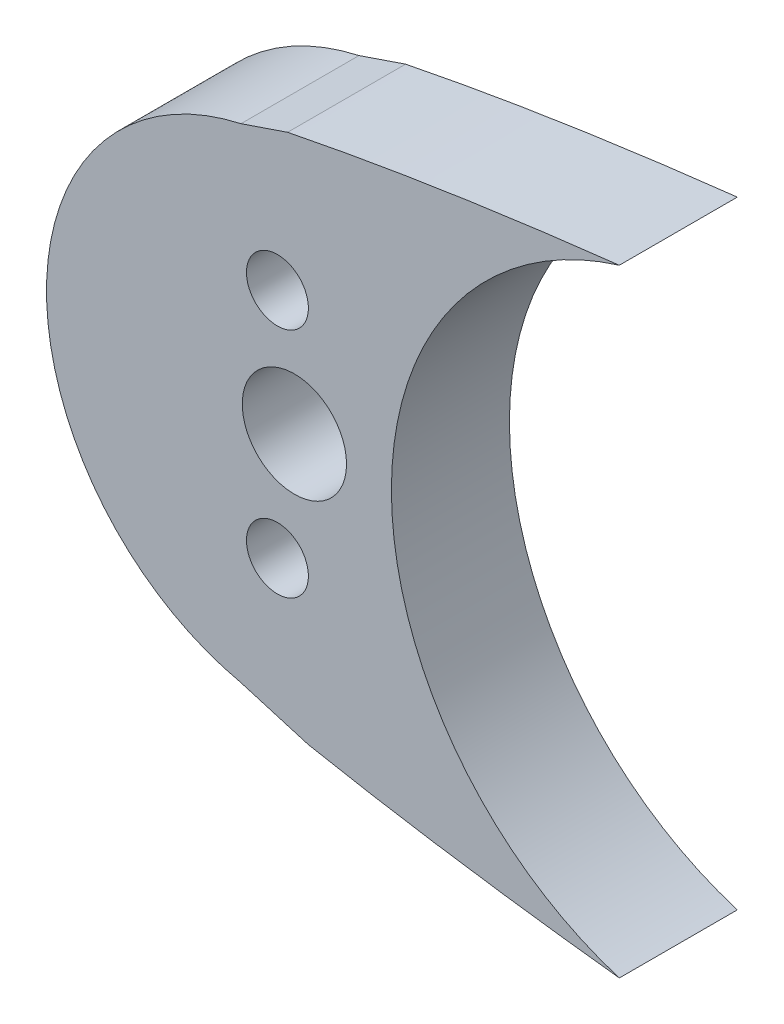
ISO-10303-21;
HEADER;
FILE_DESCRIPTION(('STEP AP214'),'2;1');
FILE_NAME('part.step','',(''),(''),'','','');
FILE_SCHEMA(('AUTOMOTIVE_DESIGN { 1 0 10303 214 1 1 1 1 }'));
ENDSEC;
DATA;
#1=APPLICATION_CONTEXT('core data for automotive mechanical design processes');
#2=APPLICATION_PROTOCOL_DEFINITION('international standard','automotive_design',2000,#1);
#3=PRODUCT_CONTEXT('',#1,'mechanical');
#4=PRODUCT('Part','Part','',(#3));
#5=PRODUCT_RELATED_PRODUCT_CATEGORY('part','',(#4));
#6=PRODUCT_DEFINITION_FORMATION('','',#4);
#7=PRODUCT_DEFINITION_CONTEXT('part definition',#1,'design');
#8=PRODUCT_DEFINITION('design','',#6,#7);
#9=PRODUCT_DEFINITION_SHAPE('','',#8);
#10=(LENGTH_UNIT() NAMED_UNIT(*) SI_UNIT(.MILLI.,.METRE.));
#11=(NAMED_UNIT(*) PLANE_ANGLE_UNIT() SI_UNIT($,.RADIAN.));
#12=(NAMED_UNIT(*) SI_UNIT($,.STERADIAN.) SOLID_ANGLE_UNIT());
#13=UNCERTAINTY_MEASURE_WITH_UNIT(LENGTH_MEASURE(1.E-05),#10,'distance_accuracy_value','');
#14=(GEOMETRIC_REPRESENTATION_CONTEXT(3) GLOBAL_UNCERTAINTY_ASSIGNED_CONTEXT((#13)) GLOBAL_UNIT_ASSIGNED_CONTEXT((#10,
#11,#12)) REPRESENTATION_CONTEXT('',''));
#15=CARTESIAN_POINT('',(0.,0.,0.));
#16=DIRECTION('',(0.,0.,1.));
#17=DIRECTION('',(1.,0.,0.));
#18=AXIS2_PLACEMENT_3D('',#15,#16,#17);
#19=CARTESIAN_POINT('',(300.,0.378,10.25));
#20=CARTESIAN_POINT('',(299.845901447221,0.39961034336831,10.25));
#21=CARTESIAN_POINT('',(299.230346714046,0.48593399083917,10.25));
#22=CARTESIAN_POINT('',(297.848901683276,0.678531057447331,10.25));
#23=CARTESIAN_POINT('',(295.556029122455,0.996787499241564,10.25));
#24=CARTESIAN_POINT('',(292.365739581197,1.43343203295321,10.25));
#25=CARTESIAN_POINT('',(288.297856433401,1.98344889126347,10.25));
#26=CARTESIAN_POINT('',(283.377248038078,2.63572648359042,10.25));
#27=CARTESIAN_POINT('',(277.63430498472,3.38149178862329,10.25));
#28=CARTESIAN_POINT('',(271.104515413466,4.20901604095742,10.25));
#29=CARTESIAN_POINT('',(263.828064626846,5.10718872872647,10.25));
#30=CARTESIAN_POINT('',(255.849823781818,6.06276893212352,10.25));
#31=CARTESIAN_POINT('',(247.21903434379,7.06424307195608,10.25));
#32=CARTESIAN_POINT('',(237.988783489903,8.09787318806774,10.25));
#33=CARTESIAN_POINT('',(228.216029511608,9.15107036010328,10.25));
#34=CARTESIAN_POINT('',(217.961088379031,10.2107446574668,10.25));
#35=CARTESIAN_POINT('',(207.287161839572,11.2632209265187,10.25));
#36=CARTESIAN_POINT('',(196.260086850424,12.2937248064858,10.25));
#37=CARTESIAN_POINT('',(184.947773044503,13.2887281219597,10.25));
#38=CARTESIAN_POINT('',(173.420088229148,14.2315961384787,10.25));
#39=CARTESIAN_POINT('',(161.747864995533,15.1069553720124,10.25));
#40=CARTESIAN_POINT('',(150.00317252135,15.8985540753976,10.25));
#41=CARTESIAN_POINT('',(138.258374542497,16.5898406039741,10.25));
#42=CARTESIAN_POINT('',(126.585774705795,17.1633504747405,10.25));
#43=CARTESIAN_POINT('',(115.057462615139,17.6037905135667,10.25));
#44=CARTESIAN_POINT('',(103.744181572864,17.8967919128621,10.25));
#45=CARTESIAN_POINT('',(92.7158453472272,18.0280433746414,10.25));
#46=CARTESIAN_POINT('',(82.0402185013839,17.9871287273908,10.25));
#47=CARTESIAN_POINT('',(71.7831190583338,17.7661449762132,10.25));
#48=CARTESIAN_POINT('',(62.0076841473254,17.3594904245971,10.25));
#49=CARTESIAN_POINT('',(52.7740834437817,16.7661013276277,10.25));
#50=CARTESIAN_POINT('',(44.1390669938569,15.987763153894,10.25));
#51=CARTESIAN_POINT('',(36.1554749512941,15.0305547578774,10.25));
#52=CARTESIAN_POINT('',(28.8719698679608,13.9026205663682,10.25));
#53=CARTESIAN_POINT('',(22.3326880228315,12.6157408879695,10.25));
#54=CARTESIAN_POINT('',(16.5759570466198,11.1844668147641,10.25));
#55=CARTESIAN_POINT('',(11.6344891822112,9.62275505380201,10.25));
#56=CARTESIAN_POINT('',(7.53339032845527,7.94515078115887,10.25));
#57=CARTESIAN_POINT('',(4.28573900369485,6.16300377839948,10.25));
#58=CARTESIAN_POINT('',(1.8965325692393,4.27279663699588,10.25));
#59=CARTESIAN_POINT('',(0.366265286449645,2.2288009510305,10.25));
#60=CARTESIAN_POINT('',(-0.170692645797294,0.,10.25));
#61=CARTESIAN_POINT('',(0.366265286449666,-2.22880095103055,10.25));
#62=CARTESIAN_POINT('',(1.89653256923925,-4.27279663699582,10.25));
#63=CARTESIAN_POINT('',(4.28573900369493,-6.16300377839955,10.25));
#64=CARTESIAN_POINT('',(7.53339032845521,-7.94515078115883,10.25));
#65=CARTESIAN_POINT('',(11.6344891822112,-9.62275505380201,10.25));
#66=CARTESIAN_POINT('',(16.5759570466199,-11.1844668147641,10.25));
#67=CARTESIAN_POINT('',(22.3326880228314,-12.6157408879695,10.25));
#68=CARTESIAN_POINT('',(28.8719698679608,-13.9026205663682,10.25));
#69=CARTESIAN_POINT('',(36.155474951294,-15.0305547578773,10.25));
#70=CARTESIAN_POINT('',(44.1390669938569,-15.987763153894,10.25));
#71=CARTESIAN_POINT('',(52.7740834437817,-16.7661013276277,10.25));
#72=CARTESIAN_POINT('',(62.0076841473254,-17.3594904245971,10.25));
#73=CARTESIAN_POINT('',(71.7831190583338,-17.7661449762132,10.25));
#74=CARTESIAN_POINT('',(82.0402185013839,-17.9871287273908,10.25));
#75=CARTESIAN_POINT('',(92.7158453472273,-18.0280433746414,10.25));
#76=CARTESIAN_POINT('',(103.744181572864,-17.8967919128621,10.25));
#77=CARTESIAN_POINT('',(115.057462615139,-17.6037905135667,10.25));
#78=CARTESIAN_POINT('',(126.585774705795,-17.1633504747405,10.25));
#79=CARTESIAN_POINT('',(138.258374542497,-16.5898406039741,10.25));
#80=CARTESIAN_POINT('',(150.00317252135,-15.8985540753976,10.25));
#81=CARTESIAN_POINT('',(161.747864995533,-15.1069553720124,10.25));
#82=CARTESIAN_POINT('',(173.420088229148,-14.2315961384787,10.25));
#83=CARTESIAN_POINT('',(184.947773044503,-13.2887281219597,10.25));
#84=CARTESIAN_POINT('',(196.260086850424,-12.2937248064858,10.25));
#85=CARTESIAN_POINT('',(207.287161839572,-11.2632209265187,10.25));
#86=CARTESIAN_POINT('',(217.961088379031,-10.2107446574668,10.25));
#87=CARTESIAN_POINT('',(228.216029511608,-9.15107036010328,10.25));
#88=CARTESIAN_POINT('',(237.988783489903,-8.09787318806774,10.25));
#89=CARTESIAN_POINT('',(247.21903434379,-7.06424307195608,10.25));
#90=CARTESIAN_POINT('',(255.849823781818,-6.0627689321235,10.25));
#91=CARTESIAN_POINT('',(263.828064626846,-5.10718872872648,10.25));
#92=CARTESIAN_POINT('',(271.104515413466,-4.20901604095741,10.25));
#93=CARTESIAN_POINT('',(277.63430498472,-3.38149178862329,10.25));
#94=CARTESIAN_POINT('',(283.377248038078,-2.63572648359043,10.25));
#95=CARTESIAN_POINT('',(288.297856433401,-1.98344889126346,10.25));
#96=CARTESIAN_POINT('',(292.365739581198,-1.43343203295321,10.25));
#97=CARTESIAN_POINT('',(295.556029122455,-0.996787499241567,10.25));
#98=CARTESIAN_POINT('',(297.848901683276,-0.678531057447318,10.25));
#99=CARTESIAN_POINT('',(299.230346714046,-0.48593399083919,10.25));
#100=CARTESIAN_POINT('',(299.845901447221,-0.399610343368311,10.25));
#101=CARTESIAN_POINT('',(300.,-0.378,10.25));
#102=B_SPLINE_CURVE_WITH_KNOTS('',3,(#19,#20,#21,#22,#23,#24,#25,#26,#27,#28,#29,#30,#31,#32,
#33,#34,#35,#36,#37,#38,#39,#40,#41,#42,#43,#44,#45,#46,#47,#48,#49,#50,#51,#52,#53,#54,#55,#56,
#57,#58,#59,#60,#61,#62,#63,#64,#65,#66,#67,#68,#69,#70,#71,#72,#73,#74,#75,#76,#77,#78,#79,#80,
#81,#82,#83,#84,#85,#86,#87,#88,#89,#90,#91,#92,#93,#94,#95,#96,#97,#98,#99,#100,#101),
.UNSPECIFIED.,.F.,.F.,(4,1,1,1,1,1,1,1,1,1,1,1,1,1,1,1,1,1,1,1,1,1,1,1,1,1,1,1,1,1,1,1,1,1,1,1,
1,1,1,1,1,1,1,1,1,1,1,1,1,1,1,1,1,1,1,1,1,1,1,1,1,1,1,1,1,1,1,1,1,1,1,1,1,1,1,1,1,1,1,1,4),(0.,
0.000763156679271448,0.00304846929193477,0.00684068957953669,0.0121161317605396,
0.0188407924276644,0.0269727495182071,0.0364598537113803,0.0472429445210447,0.0592535547279477,
0.0724172643119224,0.0866510217067198,0.101866322474926,0.117968955401192,0.134857918638583,
0.152428309483259,0.170571841082248,0.189174521814913,0.208122338288737,0.227296649324545,
0.246580070424687,0.265853108019993,0.284996761496293,0.303895241632262,0.322432580929281,
0.340498658943124,0.357984483489282,0.37478811429809,0.390812303248415,0.405965006366899,
0.420162443159487,0.433328264782086,0.445393603392471,0.456301171479378,0.466003880875037,
0.474472000637231,0.481696232103684,0.487703697963338,0.492583405321472,0.496543603187854,0.5,
0.503456396812145,0.507416594678528,0.512296302036662,0.518303767896316,0.525527999362769,
0.533996119124963,0.543698828520622,0.554606396607529,0.566671735217914,0.579837556840513,
0.594034993633101,0.609187696751585,0.62521188570191,0.642015516510718,0.659501341056876,
0.677567419070719,0.696104758367738,0.715003238503707,0.734146891980006,0.753419929575313,
0.772703350675454,0.791877661711263,0.810825478185087,0.829428158917752,0.847571690516741,
0.865142081361417,0.882031044598807,0.898133677525074,0.91334897829328,0.927582735688077,
0.940746445272052,0.952757055478955,0.96354014628862,0.973027250481793,0.981159207572336,
0.98788386823946,0.993159310420463,0.996951530708065,0.999236843320729,1.),.UNSPECIFIED.);
#103=DIRECTION('',(0.,0.,-1.));
#104=VECTOR('',#103,1.);
#105=SURFACE_OF_LINEAR_EXTRUSION('',#102,#104);
#106=DIRECTION('',(0.,0.,1.));
#107=VECTOR('',#106,1.);
#108=CARTESIAN_POINT('',(25.9948814063785,-13.3232658320539,4.25));
#109=LINE('',#108,#107);
#110=CARTESIAN_POINT('',(25.9948814063785,-13.3232658320539,4.25));
#111=VERTEX_POINT('',#110);
#112=CARTESIAN_POINT('',(25.9948814063785,-13.3232658320539,10.25));
#113=VERTEX_POINT('',#112);
#114=EDGE_CURVE('E144',#111,#113,#109,.T.);
#115=ORIENTED_EDGE('',*,*,#114,.F.);
#116=CARTESIAN_POINT('',(300.,0.378,4.25));
#117=CARTESIAN_POINT('',(299.845901447221,0.39961034336831,4.25));
#118=CARTESIAN_POINT('',(299.230346714046,0.48593399083917,4.25));
#119=CARTESIAN_POINT('',(297.848901683276,0.678531057447331,4.25));
#120=CARTESIAN_POINT('',(295.556029122455,0.996787499241564,4.25));
#121=CARTESIAN_POINT('',(292.365739581197,1.43343203295321,4.25));
#122=CARTESIAN_POINT('',(288.297856433401,1.98344889126347,4.25));
#123=CARTESIAN_POINT('',(283.377248038078,2.63572648359042,4.25));
#124=CARTESIAN_POINT('',(277.63430498472,3.38149178862329,4.25));
#125=CARTESIAN_POINT('',(271.104515413466,4.20901604095742,4.25));
#126=CARTESIAN_POINT('',(263.828064626846,5.10718872872647,4.25));
#127=CARTESIAN_POINT('',(255.849823781818,6.06276893212352,4.25));
#128=CARTESIAN_POINT('',(247.21903434379,7.06424307195608,4.25));
#129=CARTESIAN_POINT('',(237.988783489903,8.09787318806774,4.25));
#130=CARTESIAN_POINT('',(228.216029511608,9.15107036010328,4.25));
#131=CARTESIAN_POINT('',(217.961088379031,10.2107446574668,4.25));
#132=CARTESIAN_POINT('',(207.287161839572,11.2632209265187,4.25));
#133=CARTESIAN_POINT('',(196.260086850424,12.2937248064858,4.25));
#134=CARTESIAN_POINT('',(184.947773044503,13.2887281219597,4.25));
#135=CARTESIAN_POINT('',(173.420088229148,14.2315961384787,4.25));
#136=CARTESIAN_POINT('',(161.747864995533,15.1069553720124,4.25));
#137=CARTESIAN_POINT('',(150.00317252135,15.8985540753976,4.25));
#138=CARTESIAN_POINT('',(138.258374542497,16.5898406039741,4.25));
#139=CARTESIAN_POINT('',(126.585774705795,17.1633504747405,4.25));
#140=CARTESIAN_POINT('',(115.057462615139,17.6037905135667,4.25));
#141=CARTESIAN_POINT('',(103.744181572864,17.8967919128621,4.25));
#142=CARTESIAN_POINT('',(92.7158453472272,18.0280433746414,4.25));
#143=CARTESIAN_POINT('',(82.0402185013839,17.9871287273908,4.25));
#144=CARTESIAN_POINT('',(71.7831190583338,17.7661449762132,4.25));
#145=CARTESIAN_POINT('',(62.0076841473254,17.3594904245971,4.25));
#146=CARTESIAN_POINT('',(52.7740834437817,16.7661013276277,4.25));
#147=CARTESIAN_POINT('',(44.1390669938569,15.987763153894,4.25));
#148=CARTESIAN_POINT('',(36.1554749512941,15.0305547578774,4.25));
#149=CARTESIAN_POINT('',(28.8719698679608,13.9026205663682,4.25));
#150=CARTESIAN_POINT('',(22.3326880228315,12.6157408879695,4.25));
#151=CARTESIAN_POINT('',(16.5759570466198,11.1844668147641,4.25));
#152=CARTESIAN_POINT('',(11.6344891822112,9.62275505380201,4.25));
#153=CARTESIAN_POINT('',(7.53339032845527,7.94515078115887,4.25));
#154=CARTESIAN_POINT('',(4.28573900369485,6.16300377839948,4.25));
#155=CARTESIAN_POINT('',(1.8965325692393,4.27279663699588,4.25));
#156=CARTESIAN_POINT('',(0.366265286449645,2.2288009510305,4.25));
#157=CARTESIAN_POINT('',(-0.170692645797294,0.,4.25));
#158=CARTESIAN_POINT('',(0.366265286449666,-2.22880095103055,4.25));
#159=CARTESIAN_POINT('',(1.89653256923925,-4.27279663699582,4.25));
#160=CARTESIAN_POINT('',(4.28573900369493,-6.16300377839955,4.25));
#161=CARTESIAN_POINT('',(7.53339032845521,-7.94515078115883,4.25));
#162=CARTESIAN_POINT('',(11.6344891822112,-9.62275505380201,4.25));
#163=CARTESIAN_POINT('',(16.5759570466199,-11.1844668147641,4.25));
#164=CARTESIAN_POINT('',(22.3326880228314,-12.6157408879695,4.25));
#165=CARTESIAN_POINT('',(28.8719698679608,-13.9026205663682,4.25));
#166=CARTESIAN_POINT('',(36.155474951294,-15.0305547578773,4.25));
#167=CARTESIAN_POINT('',(44.1390669938569,-15.987763153894,4.25));
#168=CARTESIAN_POINT('',(52.7740834437817,-16.7661013276277,4.25));
#169=CARTESIAN_POINT('',(62.0076841473254,-17.3594904245971,4.25));
#170=CARTESIAN_POINT('',(71.7831190583338,-17.7661449762132,4.25));
#171=CARTESIAN_POINT('',(82.0402185013839,-17.9871287273908,4.25));
#172=CARTESIAN_POINT('',(92.7158453472273,-18.0280433746414,4.25));
#173=CARTESIAN_POINT('',(103.744181572864,-17.8967919128621,4.25));
#174=CARTESIAN_POINT('',(115.057462615139,-17.6037905135667,4.25));
#175=CARTESIAN_POINT('',(126.585774705795,-17.1633504747405,4.25));
#176=CARTESIAN_POINT('',(138.258374542497,-16.5898406039741,4.25));
#177=CARTESIAN_POINT('',(150.00317252135,-15.8985540753976,4.25));
#178=CARTESIAN_POINT('',(161.747864995533,-15.1069553720124,4.25));
#179=CARTESIAN_POINT('',(173.420088229148,-14.2315961384787,4.25));
#180=CARTESIAN_POINT('',(184.947773044503,-13.2887281219597,4.25));
#181=CARTESIAN_POINT('',(196.260086850424,-12.2937248064858,4.25));
#182=CARTESIAN_POINT('',(207.287161839572,-11.2632209265187,4.25));
#183=CARTESIAN_POINT('',(217.961088379031,-10.2107446574668,4.25));
#184=CARTESIAN_POINT('',(228.216029511608,-9.15107036010328,4.25));
#185=CARTESIAN_POINT('',(237.988783489903,-8.09787318806774,4.25));
#186=CARTESIAN_POINT('',(247.21903434379,-7.06424307195608,4.25));
#187=CARTESIAN_POINT('',(255.849823781818,-6.0627689321235,4.25));
#188=CARTESIAN_POINT('',(263.828064626846,-5.10718872872648,4.25));
#189=CARTESIAN_POINT('',(271.104515413466,-4.20901604095741,4.25));
#190=CARTESIAN_POINT('',(277.63430498472,-3.38149178862329,4.25));
#191=CARTESIAN_POINT('',(283.377248038078,-2.63572648359043,4.25));
#192=CARTESIAN_POINT('',(288.297856433401,-1.98344889126346,4.25));
#193=CARTESIAN_POINT('',(292.365739581198,-1.43343203295321,4.25));
#194=CARTESIAN_POINT('',(295.556029122455,-0.996787499241567,4.25));
#195=CARTESIAN_POINT('',(297.848901683276,-0.678531057447318,4.25));
#196=CARTESIAN_POINT('',(299.230346714046,-0.48593399083919,4.25));
#197=CARTESIAN_POINT('',(299.845901447221,-0.399610343368311,4.25));
#198=CARTESIAN_POINT('',(300.,-0.378,4.25));
#199=B_SPLINE_CURVE_WITH_KNOTS('',3,(#116,#117,#118,#119,#120,#121,#122,#123,#124,#125,#126,
#127,#128,#129,#130,#131,#132,#133,#134,#135,#136,#137,#138,#139,#140,#141,#142,#143,#144,#145,
#146,#147,#148,#149,#150,#151,#152,#153,#154,#155,#156,#157,#158,#159,#160,#161,#162,#163,#164,
#165,#166,#167,#168,#169,#170,#171,#172,#173,#174,#175,#176,#177,#178,#179,#180,#181,#182,#183,
#184,#185,#186,#187,#188,#189,#190,#191,#192,#193,#194,#195,#196,#197,#198),.UNSPECIFIED.,.F.,
.F.,(4,1,1,1,1,1,1,1,1,1,1,1,1,1,1,1,1,1,1,1,1,1,1,1,1,1,1,1,1,1,1,1,1,1,1,1,1,1,1,1,1,1,1,1,1,
1,1,1,1,1,1,1,1,1,1,1,1,1,1,1,1,1,1,1,1,1,1,1,1,1,1,1,1,1,1,1,1,1,1,1,4),(0.,
0.000763156679271448,0.00304846929193477,0.00684068957953669,0.0121161317605396,
0.0188407924276644,0.0269727495182071,0.0364598537113803,0.0472429445210447,0.0592535547279477,
0.0724172643119224,0.0866510217067198,0.101866322474926,0.117968955401192,0.134857918638583,
0.152428309483259,0.170571841082248,0.189174521814913,0.208122338288737,0.227296649324545,
0.246580070424687,0.265853108019993,0.284996761496293,0.303895241632262,0.322432580929281,
0.340498658943124,0.357984483489282,0.37478811429809,0.390812303248415,0.405965006366899,
0.420162443159487,0.433328264782086,0.445393603392471,0.456301171479378,0.466003880875037,
0.474472000637231,0.481696232103684,0.487703697963338,0.492583405321472,0.496543603187854,0.5,
0.503456396812145,0.507416594678528,0.512296302036662,0.518303767896316,0.525527999362769,
0.533996119124963,0.543698828520622,0.554606396607529,0.566671735217914,0.579837556840513,
0.594034993633101,0.609187696751585,0.62521188570191,0.642015516510718,0.659501341056876,
0.677567419070719,0.696104758367738,0.715003238503707,0.734146891980006,0.753419929575313,
0.772703350675454,0.791877661711263,0.810825478185087,0.829428158917752,0.847571690516741,
0.865142081361417,0.882031044598807,0.898133677525074,0.91334897829328,0.927582735688077,
0.940746445272052,0.952757055478955,0.96354014628862,0.973027250481793,0.981159207572336,
0.98788386823946,0.993159310420463,0.996951530708065,0.999236843320729,1.),.UNSPECIFIED.);
#200=CARTESIAN_POINT('',(41.8013292621555,-15.6914438658387,4.25));
#201=VERTEX_POINT('',#200);
#202=EDGE_CURVE('E143',#111,#201,#199,.T.);
#203=ORIENTED_EDGE('',*,*,#202,.T.);
#204=DIRECTION('',(0.,0.,1.));
#205=VECTOR('',#204,1.);
#206=CARTESIAN_POINT('',(41.8013292621556,-15.6914438658387,4.25));
#207=LINE('',#206,#205);
#208=CARTESIAN_POINT('',(41.8013292621556,-15.6914438658387,10.25));
#209=VERTEX_POINT('',#208);
#210=EDGE_CURVE('E63',#201,#209,#207,.T.);
#211=ORIENTED_EDGE('',*,*,#210,.T.);
#212=EDGE_CURVE('E160',#113,#209,#102,.T.);
#213=ORIENTED_EDGE('',*,*,#212,.F.);
#214=EDGE_LOOP('',(#115,#203,#211,#213));
#215=FACE_BOUND('',#214,.T.);
#216=ADVANCED_FACE('F45',(#215),#105,.F.);
#217=CARTESIAN_POINT('',(0.,0.,10.25));
#218=DIRECTION('',(0.,0.,1.));
#219=DIRECTION('',(1.,0.,0.));
#220=AXIS2_PLACEMENT_3D('',#217,#218,#219);
#221=PLANE('',#220);
#222=CARTESIAN_POINT('',(24.4188287582101,5.9,10.25));
#223=DIRECTION('',(0.,0.,1.));
#224=DIRECTION('',(1.,0.,0.));
#225=AXIS2_PLACEMENT_3D('',#222,#223,#224);
#226=CIRCLE('',#225,1.575);
#227=CARTESIAN_POINT('',(25.9938287582101,5.9,10.25));
#228=VERTEX_POINT('',#227);
#229=EDGE_CURVE('E362',#228,#228,#226,.T.);
#230=ORIENTED_EDGE('',*,*,#229,.F.);
#231=EDGE_LOOP('',(#230));
#232=FACE_BOUND('',#231,.T.);
#233=CARTESIAN_POINT('',(24.4188287582101,-5.9,10.25));
#234=DIRECTION('',(0.,0.,1.));
#235=DIRECTION('',(1.,0.,0.));
#236=AXIS2_PLACEMENT_3D('',#233,#234,#235);
#237=CIRCLE('',#236,1.575);
#238=CARTESIAN_POINT('',(25.9938287582101,-5.9,10.25));
#239=VERTEX_POINT('',#238);
#240=EDGE_CURVE('E131',#239,#239,#237,.T.);
#241=ORIENTED_EDGE('',*,*,#240,.F.);
#242=EDGE_LOOP('',(#241));
#243=FACE_BOUND('',#242,.T.);
#244=CARTESIAN_POINT('',(25.2816825118974,0.,10.25));
#245=DIRECTION('',(0.,0.,1.));
#246=DIRECTION('',(1.,0.,0.));
#247=AXIS2_PLACEMENT_3D('',#244,#245,#246);
#248=CIRCLE('',#247,2.65);
#249=CARTESIAN_POINT('',(27.9316825118974,0.,10.25));
#250=VERTEX_POINT('',#249);
#251=EDGE_CURVE('E11',#250,#250,#248,.T.);
#252=ORIENTED_EDGE('',*,*,#251,.F.);
#253=EDGE_LOOP('',(#252));
#254=FACE_BOUND('',#253,.T.);
#255=CARTESIAN_POINT('',(25.2816825118974,0.,10.25));
#256=DIRECTION('',(0.,0.,1.));
#257=DIRECTION('',(1.,0.,0.));
#258=AXIS2_PLACEMENT_3D('',#255,#256,#257);
#259=CIRCLE('',#258,12.6029912297421);
#260=CARTESIAN_POINT('',(22.5646752941784,12.3066347843681,10.25));
#261=VERTEX_POINT('',#260);
#262=CARTESIAN_POINT('',(22.5646752941784,-12.3066347843681,10.25));
#263=VERTEX_POINT('',#262);
#264=EDGE_CURVE('E108',#261,#263,#259,.T.);
#265=ORIENTED_EDGE('',*,*,#264,.T.);
#266=DIRECTION('',(0.95877727401165,-0.284158650825184,0.));
#267=VECTOR('',#266,1.);
#268=CARTESIAN_POINT('',(-1.53086894520747,-5.16529181811919,10.25));
#269=LINE('',#268,#267);
#270=EDGE_CURVE('E124',#263,#113,#269,.T.);
#271=ORIENTED_EDGE('',*,*,#270,.T.);
#272=ORIENTED_EDGE('',*,*,#212,.T.);
#273=CARTESIAN_POINT('',(46.6322388953236,0.,10.25));
#274=DIRECTION('',(0.,0.,1.));
#275=DIRECTION('',(1.,0.,0.));
#276=AXIS2_PLACEMENT_3D('',#273,#274,#275);
#277=CIRCLE('',#276,16.4182550375673);
#278=CARTESIAN_POINT('',(41.8013292621556,15.6914438658387,10.25));
#279=VERTEX_POINT('',#278);
#280=EDGE_CURVE('E153',#279,#209,#277,.T.);
#281=ORIENTED_EDGE('',*,*,#280,.F.);
#282=CARTESIAN_POINT('',(300.,0.378,10.25));
#283=CARTESIAN_POINT('',(299.845901447221,0.39961034336831,10.25));
#284=CARTESIAN_POINT('',(299.230346714046,0.48593399083917,10.25));
#285=CARTESIAN_POINT('',(297.848901683276,0.678531057447331,10.25));
#286=CARTESIAN_POINT('',(295.556029122455,0.996787499241564,10.25));
#287=CARTESIAN_POINT('',(292.365739581197,1.43343203295321,10.25));
#288=CARTESIAN_POINT('',(288.297856433401,1.98344889126347,10.25));
#289=CARTESIAN_POINT('',(283.377248038078,2.63572648359042,10.25));
#290=CARTESIAN_POINT('',(277.63430498472,3.38149178862329,10.25));
#291=CARTESIAN_POINT('',(271.104515413466,4.20901604095742,10.25));
#292=CARTESIAN_POINT('',(263.828064626846,5.10718872872647,10.25));
#293=CARTESIAN_POINT('',(255.849823781818,6.06276893212352,10.25));
#294=CARTESIAN_POINT('',(247.21903434379,7.06424307195608,10.25));
#295=CARTESIAN_POINT('',(237.988783489903,8.09787318806774,10.25));
#296=CARTESIAN_POINT('',(228.216029511608,9.15107036010328,10.25));
#297=CARTESIAN_POINT('',(217.961088379031,10.2107446574668,10.25));
#298=CARTESIAN_POINT('',(207.287161839572,11.2632209265187,10.25));
#299=CARTESIAN_POINT('',(196.260086850424,12.2937248064858,10.25));
#300=CARTESIAN_POINT('',(184.947773044503,13.2887281219597,10.25));
#301=CARTESIAN_POINT('',(173.420088229148,14.2315961384787,10.25));
#302=CARTESIAN_POINT('',(161.747864995533,15.1069553720124,10.25));
#303=CARTESIAN_POINT('',(150.00317252135,15.8985540753976,10.25));
#304=CARTESIAN_POINT('',(138.258374542497,16.5898406039741,10.25));
#305=CARTESIAN_POINT('',(126.585774705795,17.1633504747405,10.25));
#306=CARTESIAN_POINT('',(115.057462615139,17.6037905135667,10.25));
#307=CARTESIAN_POINT('',(103.744181572864,17.8967919128621,10.25));
#308=CARTESIAN_POINT('',(92.7158453472272,18.0280433746414,10.25));
#309=CARTESIAN_POINT('',(82.0402185013839,17.9871287273908,10.25));
#310=CARTESIAN_POINT('',(71.7831190583338,17.7661449762132,10.25));
#311=CARTESIAN_POINT('',(62.0076841473254,17.3594904245971,10.25));
#312=CARTESIAN_POINT('',(52.7740834437817,16.7661013276277,10.25));
#313=CARTESIAN_POINT('',(44.1390669938569,15.987763153894,10.25));
#314=CARTESIAN_POINT('',(36.1554749512941,15.0305547578774,10.25));
#315=CARTESIAN_POINT('',(28.8719698679608,13.9026205663682,10.25));
#316=CARTESIAN_POINT('',(22.3326880228315,12.6157408879695,10.25));
#317=CARTESIAN_POINT('',(16.5759570466198,11.1844668147641,10.25));
#318=CARTESIAN_POINT('',(11.6344891822112,9.62275505380201,10.25));
#319=CARTESIAN_POINT('',(7.53339032845527,7.94515078115887,10.25));
#320=CARTESIAN_POINT('',(4.28573900369485,6.16300377839948,10.25));
#321=CARTESIAN_POINT('',(1.8965325692393,4.27279663699588,10.25));
#322=CARTESIAN_POINT('',(0.366265286449645,2.2288009510305,10.25));
#323=CARTESIAN_POINT('',(-0.170692645797294,0.,10.25));
#324=CARTESIAN_POINT('',(0.366265286449666,-2.22880095103055,10.25));
#325=CARTESIAN_POINT('',(1.89653256923925,-4.27279663699582,10.25));
#326=CARTESIAN_POINT('',(4.28573900369493,-6.16300377839955,10.25));
#327=CARTESIAN_POINT('',(7.53339032845521,-7.94515078115883,10.25));
#328=CARTESIAN_POINT('',(11.6344891822112,-9.62275505380201,10.25));
#329=CARTESIAN_POINT('',(16.5759570466199,-11.1844668147641,10.25));
#330=CARTESIAN_POINT('',(22.3326880228314,-12.6157408879695,10.25));
#331=CARTESIAN_POINT('',(28.8719698679608,-13.9026205663682,10.25));
#332=CARTESIAN_POINT('',(36.155474951294,-15.0305547578773,10.25));
#333=CARTESIAN_POINT('',(44.1390669938569,-15.987763153894,10.25));
#334=CARTESIAN_POINT('',(52.7740834437817,-16.7661013276277,10.25));
#335=CARTESIAN_POINT('',(62.0076841473254,-17.3594904245971,10.25));
#336=CARTESIAN_POINT('',(71.7831190583338,-17.7661449762132,10.25));
#337=CARTESIAN_POINT('',(82.0402185013839,-17.9871287273908,10.25));
#338=CARTESIAN_POINT('',(92.7158453472273,-18.0280433746414,10.25));
#339=CARTESIAN_POINT('',(103.744181572864,-17.8967919128621,10.25));
#340=CARTESIAN_POINT('',(115.057462615139,-17.6037905135667,10.25));
#341=CARTESIAN_POINT('',(126.585774705795,-17.1633504747405,10.25));
#342=CARTESIAN_POINT('',(138.258374542497,-16.5898406039741,10.25));
#343=CARTESIAN_POINT('',(150.00317252135,-15.8985540753976,10.25));
#344=CARTESIAN_POINT('',(161.747864995533,-15.1069553720124,10.25));
#345=CARTESIAN_POINT('',(173.420088229148,-14.2315961384787,10.25));
#346=CARTESIAN_POINT('',(184.947773044503,-13.2887281219597,10.25));
#347=CARTESIAN_POINT('',(196.260086850424,-12.2937248064858,10.25));
#348=CARTESIAN_POINT('',(207.287161839572,-11.2632209265187,10.25));
#349=CARTESIAN_POINT('',(217.961088379031,-10.2107446574668,10.25));
#350=CARTESIAN_POINT('',(228.216029511608,-9.15107036010328,10.25));
#351=CARTESIAN_POINT('',(237.988783489903,-8.09787318806774,10.25));
#352=CARTESIAN_POINT('',(247.21903434379,-7.06424307195608,10.25));
#353=CARTESIAN_POINT('',(255.849823781818,-6.0627689321235,10.25));
#354=CARTESIAN_POINT('',(263.828064626846,-5.10718872872648,10.25));
#355=CARTESIAN_POINT('',(271.104515413466,-4.20901604095741,10.25));
#356=CARTESIAN_POINT('',(277.63430498472,-3.38149178862329,10.25));
#357=CARTESIAN_POINT('',(283.377248038078,-2.63572648359043,10.25));
#358=CARTESIAN_POINT('',(288.297856433401,-1.98344889126346,10.25));
#359=CARTESIAN_POINT('',(292.365739581198,-1.43343203295321,10.25));
#360=CARTESIAN_POINT('',(295.556029122455,-0.996787499241567,10.25));
#361=CARTESIAN_POINT('',(297.848901683276,-0.678531057447318,10.25));
#362=CARTESIAN_POINT('',(299.230346714046,-0.48593399083919,10.25));
#363=CARTESIAN_POINT('',(299.845901447221,-0.399610343368311,10.25));
#364=CARTESIAN_POINT('',(300.,-0.378,10.25));
#365=B_SPLINE_CURVE_WITH_KNOTS('',3,(#282,#283,#284,#285,#286,#287,#288,#289,#290,#291,#292,
#293,#294,#295,#296,#297,#298,#299,#300,#301,#302,#303,#304,#305,#306,#307,#308,#309,#310,#311,
#312,#313,#314,#315,#316,#317,#318,#319,#320,#321,#322,#323,#324,#325,#326,#327,#328,#329,#330,
#331,#332,#333,#334,#335,#336,#337,#338,#339,#340,#341,#342,#343,#344,#345,#346,#347,#348,#349,
#350,#351,#352,#353,#354,#355,#356,#357,#358,#359,#360,#361,#362,#363,#364),.UNSPECIFIED.,.F.,
.F.,(4,1,1,1,1,1,1,1,1,1,1,1,1,1,1,1,1,1,1,1,1,1,1,1,1,1,1,1,1,1,1,1,1,1,1,1,1,1,1,1,1,1,1,1,1,
1,1,1,1,1,1,1,1,1,1,1,1,1,1,1,1,1,1,1,1,1,1,1,1,1,1,1,1,1,1,1,1,1,1,1,4),(0.,
0.000763156679271448,0.00304846929193477,0.00684068957953669,0.0121161317605396,
0.0188407924276644,0.0269727495182071,0.0364598537113803,0.0472429445210447,0.0592535547279477,
0.0724172643119224,0.0866510217067198,0.101866322474926,0.117968955401192,0.134857918638583,
0.152428309483259,0.170571841082248,0.189174521814913,0.208122338288737,0.227296649324545,
0.246580070424687,0.265853108019993,0.284996761496293,0.303895241632262,0.322432580929281,
0.340498658943124,0.357984483489282,0.37478811429809,0.390812303248415,0.405965006366899,
0.420162443159487,0.433328264782086,0.445393603392471,0.456301171479378,0.466003880875037,
0.474472000637231,0.481696232103684,0.487703697963338,0.492583405321472,0.496543603187854,0.5,
0.503456396812145,0.507416594678528,0.512296302036662,0.518303767896316,0.525527999362769,
0.533996119124963,0.543698828520622,0.554606396607529,0.566671735217914,0.579837556840513,
0.594034993633101,0.609187696751585,0.62521188570191,0.642015516510718,0.659501341056876,
0.677567419070719,0.696104758367738,0.715003238503707,0.734146891980006,0.753419929575313,
0.772703350675454,0.791877661711263,0.810825478185087,0.829428158917752,0.847571690516741,
0.865142081361417,0.882031044598807,0.898133677525074,0.91334897829328,0.927582735688077,
0.940746445272052,0.952757055478955,0.96354014628862,0.973027250481793,0.981159207572336,
0.98788386823946,0.993159310420463,0.996951530708065,0.999236843320729,1.),.UNSPECIFIED.);
#366=CARTESIAN_POINT('',(24.9362201555125,13.1137753979476,10.25));
#367=VERTEX_POINT('',#366);
#368=EDGE_CURVE('E55',#279,#367,#365,.T.);
#369=ORIENTED_EDGE('',*,*,#368,.T.);
#370=DIRECTION('',(0.946673505145655,0.322194467139396,0.));
#371=VECTOR('',#370,1.);
#372=CARTESIAN_POINT('',(-1.4112605963445,4.14657342590983,10.25));
#373=LINE('',#372,#371);
#374=EDGE_CURVE('E128',#261,#367,#373,.T.);
#375=ORIENTED_EDGE('',*,*,#374,.F.);
#376=EDGE_LOOP('',(#265,#271,#272,#281,#369,#375));
#377=FACE_BOUND('',#376,.T.);
#378=ADVANCED_FACE('F190',(#232,#243,#254,#377),#221,.T.);
#379=CARTESIAN_POINT('',(0.,0.,4.25));
#380=DIRECTION('',(0.,0.,1.));
#381=DIRECTION('',(1.,0.,0.));
#382=AXIS2_PLACEMENT_3D('',#379,#380,#381);
#383=PLANE('',#382);
#384=CARTESIAN_POINT('',(24.4188287582101,5.9,4.25));
#385=DIRECTION('',(0.,0.,1.));
#386=DIRECTION('',(1.,0.,0.));
#387=AXIS2_PLACEMENT_3D('',#384,#385,#386);
#388=CIRCLE('',#387,1.575);
#389=CARTESIAN_POINT('',(25.9938287582101,5.9,4.25));
#390=VERTEX_POINT('',#389);
#391=EDGE_CURVE('E156',#390,#390,#388,.T.);
#392=ORIENTED_EDGE('',*,*,#391,.T.);
#393=EDGE_LOOP('',(#392));
#394=FACE_BOUND('',#393,.T.);
#395=CARTESIAN_POINT('',(24.4188287582101,-5.9,4.25));
#396=DIRECTION('',(0.,0.,1.));
#397=DIRECTION('',(1.,0.,0.));
#398=AXIS2_PLACEMENT_3D('',#395,#396,#397);
#399=CIRCLE('',#398,1.575);
#400=CARTESIAN_POINT('',(25.9938287582101,-5.9,4.25));
#401=VERTEX_POINT('',#400);
#402=EDGE_CURVE('E364',#401,#401,#399,.T.);
#403=ORIENTED_EDGE('',*,*,#402,.T.);
#404=EDGE_LOOP('',(#403));
#405=FACE_BOUND('',#404,.T.);
#406=CARTESIAN_POINT('',(25.2816825118974,0.,4.25));
#407=DIRECTION('',(0.,0.,1.));
#408=DIRECTION('',(1.,0.,0.));
#409=AXIS2_PLACEMENT_3D('',#406,#407,#408);
#410=CIRCLE('',#409,2.65);
#411=CARTESIAN_POINT('',(27.9316825118974,0.,4.25));
#412=VERTEX_POINT('',#411);
#413=EDGE_CURVE('E49',#412,#412,#410,.T.);
#414=ORIENTED_EDGE('',*,*,#413,.T.);
#415=EDGE_LOOP('',(#414));
#416=FACE_BOUND('',#415,.T.);
#417=DIRECTION('',(0.95877727401165,-0.284158650825184,0.));
#418=VECTOR('',#417,1.);
#419=CARTESIAN_POINT('',(-1.53086894520747,-5.16529181811919,4.25));
#420=LINE('',#419,#418);
#421=CARTESIAN_POINT('',(22.5646752941784,-12.3066347843681,4.25));
#422=VERTEX_POINT('',#421);
#423=EDGE_CURVE('E111',#422,#111,#420,.T.);
#424=ORIENTED_EDGE('',*,*,#423,.F.);
#425=CARTESIAN_POINT('',(25.2816825118974,0.,4.25));
#426=DIRECTION('',(0.,0.,1.));
#427=DIRECTION('',(1.,0.,0.));
#428=AXIS2_PLACEMENT_3D('',#425,#426,#427);
#429=CIRCLE('',#428,12.6029912297421);
#430=CARTESIAN_POINT('',(22.5646752941784,12.3066347843681,4.25));
#431=VERTEX_POINT('',#430);
#432=EDGE_CURVE('E105',#431,#422,#429,.T.);
#433=ORIENTED_EDGE('',*,*,#432,.F.);
#434=DIRECTION('',(0.946673505145655,0.322194467139396,0.));
#435=VECTOR('',#434,1.);
#436=CARTESIAN_POINT('',(-1.4112605963445,4.14657342590983,4.25));
#437=LINE('',#436,#435);
#438=CARTESIAN_POINT('',(24.9362201555125,13.1137753979476,4.25));
#439=VERTEX_POINT('',#438);
#440=EDGE_CURVE('E113',#431,#439,#437,.T.);
#441=ORIENTED_EDGE('',*,*,#440,.T.);
#442=CARTESIAN_POINT('',(300.,0.378,4.25));
#443=CARTESIAN_POINT('',(299.845901447221,0.39961034336831,4.25));
#444=CARTESIAN_POINT('',(299.230346714046,0.48593399083917,4.25));
#445=CARTESIAN_POINT('',(297.848901683276,0.678531057447331,4.25));
#446=CARTESIAN_POINT('',(295.556029122455,0.996787499241564,4.25));
#447=CARTESIAN_POINT('',(292.365739581197,1.43343203295321,4.25));
#448=CARTESIAN_POINT('',(288.297856433401,1.98344889126347,4.25));
#449=CARTESIAN_POINT('',(283.377248038078,2.63572648359042,4.25));
#450=CARTESIAN_POINT('',(277.63430498472,3.38149178862329,4.25));
#451=CARTESIAN_POINT('',(271.104515413466,4.20901604095742,4.25));
#452=CARTESIAN_POINT('',(263.828064626846,5.10718872872647,4.25));
#453=CARTESIAN_POINT('',(255.849823781818,6.06276893212352,4.25));
#454=CARTESIAN_POINT('',(247.21903434379,7.06424307195608,4.25));
#455=CARTESIAN_POINT('',(237.988783489903,8.09787318806774,4.25));
#456=CARTESIAN_POINT('',(228.216029511608,9.15107036010328,4.25));
#457=CARTESIAN_POINT('',(217.961088379031,10.2107446574668,4.25));
#458=CARTESIAN_POINT('',(207.287161839572,11.2632209265187,4.25));
#459=CARTESIAN_POINT('',(196.260086850424,12.2937248064858,4.25));
#460=CARTESIAN_POINT('',(184.947773044503,13.2887281219597,4.25));
#461=CARTESIAN_POINT('',(173.420088229148,14.2315961384787,4.25));
#462=CARTESIAN_POINT('',(161.747864995533,15.1069553720124,4.25));
#463=CARTESIAN_POINT('',(150.00317252135,15.8985540753976,4.25));
#464=CARTESIAN_POINT('',(138.258374542497,16.5898406039741,4.25));
#465=CARTESIAN_POINT('',(126.585774705795,17.1633504747405,4.25));
#466=CARTESIAN_POINT('',(115.057462615139,17.6037905135667,4.25));
#467=CARTESIAN_POINT('',(103.744181572864,17.8967919128621,4.25));
#468=CARTESIAN_POINT('',(92.7158453472272,18.0280433746414,4.25));
#469=CARTESIAN_POINT('',(82.0402185013839,17.9871287273908,4.25));
#470=CARTESIAN_POINT('',(71.7831190583338,17.7661449762132,4.25));
#471=CARTESIAN_POINT('',(62.0076841473254,17.3594904245971,4.25));
#472=CARTESIAN_POINT('',(52.7740834437817,16.7661013276277,4.25));
#473=CARTESIAN_POINT('',(44.1390669938569,15.987763153894,4.25));
#474=CARTESIAN_POINT('',(36.1554749512941,15.0305547578774,4.25));
#475=CARTESIAN_POINT('',(28.8719698679608,13.9026205663682,4.25));
#476=CARTESIAN_POINT('',(22.3326880228315,12.6157408879695,4.25));
#477=CARTESIAN_POINT('',(16.5759570466198,11.1844668147641,4.25));
#478=CARTESIAN_POINT('',(11.6344891822112,9.62275505380201,4.25));
#479=CARTESIAN_POINT('',(7.53339032845527,7.94515078115887,4.25));
#480=CARTESIAN_POINT('',(4.28573900369485,6.16300377839948,4.25));
#481=CARTESIAN_POINT('',(1.8965325692393,4.27279663699588,4.25));
#482=CARTESIAN_POINT('',(0.366265286449645,2.2288009510305,4.25));
#483=CARTESIAN_POINT('',(-0.170692645797294,0.,4.25));
#484=CARTESIAN_POINT('',(0.366265286449666,-2.22880095103055,4.25));
#485=CARTESIAN_POINT('',(1.89653256923925,-4.27279663699582,4.25));
#486=CARTESIAN_POINT('',(4.28573900369493,-6.16300377839955,4.25));
#487=CARTESIAN_POINT('',(7.53339032845521,-7.94515078115883,4.25));
#488=CARTESIAN_POINT('',(11.6344891822112,-9.62275505380201,4.25));
#489=CARTESIAN_POINT('',(16.5759570466199,-11.1844668147641,4.25));
#490=CARTESIAN_POINT('',(22.3326880228314,-12.6157408879695,4.25));
#491=CARTESIAN_POINT('',(28.8719698679608,-13.9026205663682,4.25));
#492=CARTESIAN_POINT('',(36.155474951294,-15.0305547578773,4.25));
#493=CARTESIAN_POINT('',(44.1390669938569,-15.987763153894,4.25));
#494=CARTESIAN_POINT('',(52.7740834437817,-16.7661013276277,4.25));
#495=CARTESIAN_POINT('',(62.0076841473254,-17.3594904245971,4.25));
#496=CARTESIAN_POINT('',(71.7831190583338,-17.7661449762132,4.25));
#497=CARTESIAN_POINT('',(82.0402185013839,-17.9871287273908,4.25));
#498=CARTESIAN_POINT('',(92.7158453472273,-18.0280433746414,4.25));
#499=CARTESIAN_POINT('',(103.744181572864,-17.8967919128621,4.25));
#500=CARTESIAN_POINT('',(115.057462615139,-17.6037905135667,4.25));
#501=CARTESIAN_POINT('',(126.585774705795,-17.1633504747405,4.25));
#502=CARTESIAN_POINT('',(138.258374542497,-16.5898406039741,4.25));
#503=CARTESIAN_POINT('',(150.00317252135,-15.8985540753976,4.25));
#504=CARTESIAN_POINT('',(161.747864995533,-15.1069553720124,4.25));
#505=CARTESIAN_POINT('',(173.420088229148,-14.2315961384787,4.25));
#506=CARTESIAN_POINT('',(184.947773044503,-13.2887281219597,4.25));
#507=CARTESIAN_POINT('',(196.260086850424,-12.2937248064858,4.25));
#508=CARTESIAN_POINT('',(207.287161839572,-11.2632209265187,4.25));
#509=CARTESIAN_POINT('',(217.961088379031,-10.2107446574668,4.25));
#510=CARTESIAN_POINT('',(228.216029511608,-9.15107036010328,4.25));
#511=CARTESIAN_POINT('',(237.988783489903,-8.09787318806774,4.25));
#512=CARTESIAN_POINT('',(247.21903434379,-7.06424307195608,4.25));
#513=CARTESIAN_POINT('',(255.849823781818,-6.0627689321235,4.25));
#514=CARTESIAN_POINT('',(263.828064626846,-5.10718872872648,4.25));
#515=CARTESIAN_POINT('',(271.104515413466,-4.20901604095741,4.25));
#516=CARTESIAN_POINT('',(277.63430498472,-3.38149178862329,4.25));
#517=CARTESIAN_POINT('',(283.377248038078,-2.63572648359043,4.25));
#518=CARTESIAN_POINT('',(288.297856433401,-1.98344889126346,4.25));
#519=CARTESIAN_POINT('',(292.365739581198,-1.43343203295321,4.25));
#520=CARTESIAN_POINT('',(295.556029122455,-0.996787499241567,4.25));
#521=CARTESIAN_POINT('',(297.848901683276,-0.678531057447318,4.25));
#522=CARTESIAN_POINT('',(299.230346714046,-0.48593399083919,4.25));
#523=CARTESIAN_POINT('',(299.845901447221,-0.399610343368311,4.25));
#524=CARTESIAN_POINT('',(300.,-0.378,4.25));
#525=B_SPLINE_CURVE_WITH_KNOTS('',3,(#442,#443,#444,#445,#446,#447,#448,#449,#450,#451,#452,
#453,#454,#455,#456,#457,#458,#459,#460,#461,#462,#463,#464,#465,#466,#467,#468,#469,#470,#471,
#472,#473,#474,#475,#476,#477,#478,#479,#480,#481,#482,#483,#484,#485,#486,#487,#488,#489,#490,
#491,#492,#493,#494,#495,#496,#497,#498,#499,#500,#501,#502,#503,#504,#505,#506,#507,#508,#509,
#510,#511,#512,#513,#514,#515,#516,#517,#518,#519,#520,#521,#522,#523,#524),.UNSPECIFIED.,.F.,
.F.,(4,1,1,1,1,1,1,1,1,1,1,1,1,1,1,1,1,1,1,1,1,1,1,1,1,1,1,1,1,1,1,1,1,1,1,1,1,1,1,1,1,1,1,1,1,
1,1,1,1,1,1,1,1,1,1,1,1,1,1,1,1,1,1,1,1,1,1,1,1,1,1,1,1,1,1,1,1,1,1,1,4),(0.,
0.000763156679271448,0.00304846929193477,0.00684068957953669,0.0121161317605396,
0.0188407924276644,0.0269727495182071,0.0364598537113803,0.0472429445210447,0.0592535547279477,
0.0724172643119224,0.0866510217067198,0.101866322474926,0.117968955401192,0.134857918638583,
0.152428309483259,0.170571841082248,0.189174521814913,0.208122338288737,0.227296649324545,
0.246580070424687,0.265853108019993,0.284996761496293,0.303895241632262,0.322432580929281,
0.340498658943124,0.357984483489282,0.37478811429809,0.390812303248415,0.405965006366899,
0.420162443159487,0.433328264782086,0.445393603392471,0.456301171479378,0.466003880875037,
0.474472000637231,0.481696232103684,0.487703697963338,0.492583405321472,0.496543603187854,0.5,
0.503456396812145,0.507416594678528,0.512296302036662,0.518303767896316,0.525527999362769,
0.533996119124963,0.543698828520622,0.554606396607529,0.566671735217914,0.579837556840513,
0.594034993633101,0.609187696751585,0.62521188570191,0.642015516510718,0.659501341056876,
0.677567419070719,0.696104758367738,0.715003238503707,0.734146891980006,0.753419929575313,
0.772703350675454,0.791877661711263,0.810825478185087,0.829428158917752,0.847571690516741,
0.865142081361417,0.882031044598807,0.898133677525074,0.91334897829328,0.927582735688077,
0.940746445272052,0.952757055478955,0.96354014628862,0.973027250481793,0.981159207572336,
0.98788386823946,0.993159310420463,0.996951530708065,0.999236843320729,1.),.UNSPECIFIED.);
#526=CARTESIAN_POINT('',(41.8013292621556,15.6914438658387,4.25));
#527=VERTEX_POINT('',#526);
#528=EDGE_CURVE('E224',#527,#439,#525,.T.);
#529=ORIENTED_EDGE('',*,*,#528,.F.);
#530=CARTESIAN_POINT('',(46.6322388953236,0.,4.25));
#531=DIRECTION('',(0.,0.,1.));
#532=DIRECTION('',(1.,0.,0.));
#533=AXIS2_PLACEMENT_3D('',#530,#531,#532);
#534=CIRCLE('',#533,16.4182550375673);
#535=EDGE_CURVE('E149',#527,#201,#534,.T.);
#536=ORIENTED_EDGE('',*,*,#535,.T.);
#537=ORIENTED_EDGE('',*,*,#202,.F.);
#538=EDGE_LOOP('',(#424,#433,#441,#529,#536,#537));
#539=FACE_BOUND('',#538,.T.);
#540=ADVANCED_FACE('F121',(#394,#405,#416,#539),#383,.F.);
#541=DIRECTION('',(0.,0.,-1.));
#542=VECTOR('',#541,1.);
#543=SURFACE_OF_LINEAR_EXTRUSION('',#365,#542);
#544=ORIENTED_EDGE('',*,*,#528,.T.);
#545=DIRECTION('',(0.,0.,1.));
#546=VECTOR('',#545,1.);
#547=CARTESIAN_POINT('',(24.9362201555125,13.1137753979476,4.25));
#548=LINE('',#547,#546);
#549=EDGE_CURVE('E71',#439,#367,#548,.T.);
#550=ORIENTED_EDGE('',*,*,#549,.T.);
#551=ORIENTED_EDGE('',*,*,#368,.F.);
#552=DIRECTION('',(0.,0.,1.));
#553=VECTOR('',#552,1.);
#554=CARTESIAN_POINT('',(41.8013292621556,15.6914438658387,4.25));
#555=LINE('',#554,#553);
#556=EDGE_CURVE('E152',#527,#279,#555,.T.);
#557=ORIENTED_EDGE('',*,*,#556,.F.);
#558=EDGE_LOOP('',(#544,#550,#551,#557));
#559=FACE_BOUND('',#558,.T.);
#560=ADVANCED_FACE('F179',(#559),#543,.F.);
#561=CARTESIAN_POINT('',(25.2816825118974,0.,10.25));
#562=DIRECTION('',(0.,0.,-1.));
#563=DIRECTION('',(-1.,0.,0.));
#564=AXIS2_PLACEMENT_3D('',#561,#562,#563);
#565=CYLINDRICAL_SURFACE('',#564,2.65);
#566=ORIENTED_EDGE('',*,*,#251,.T.);
#567=EDGE_LOOP('',(#566));
#568=FACE_BOUND('',#567,.T.);
#569=ORIENTED_EDGE('',*,*,#413,.F.);
#570=EDGE_LOOP('',(#569));
#571=FACE_BOUND('',#570,.T.);
#572=ADVANCED_FACE('F182',(#568,#571),#565,.F.);
#573=CARTESIAN_POINT('',(46.6322388953236,0.,4.25));
#574=DIRECTION('',(0.,0.,1.));
#575=DIRECTION('',(1.,0.,0.));
#576=AXIS2_PLACEMENT_3D('',#573,#574,#575);
#577=CYLINDRICAL_SURFACE('',#576,16.4182550375673);
#578=ORIENTED_EDGE('',*,*,#280,.T.);
#579=ORIENTED_EDGE('',*,*,#210,.F.);
#580=ORIENTED_EDGE('',*,*,#535,.F.);
#581=ORIENTED_EDGE('',*,*,#556,.T.);
#582=EDGE_LOOP('',(#578,#579,#580,#581));
#583=FACE_BOUND('',#582,.T.);
#584=ADVANCED_FACE('F186',(#583),#577,.F.);
#585=CARTESIAN_POINT('',(25.2816825118974,0.,4.25));
#586=DIRECTION('',(0.,0.,1.));
#587=DIRECTION('',(1.,0.,0.));
#588=AXIS2_PLACEMENT_3D('',#585,#586,#587);
#589=CYLINDRICAL_SURFACE('',#588,12.6029912297421);
#590=ORIENTED_EDGE('',*,*,#264,.F.);
#591=DIRECTION('',(0.,0.,1.));
#592=VECTOR('',#591,1.);
#593=CARTESIAN_POINT('',(22.5646752941784,12.3066347843681,4.25));
#594=LINE('',#593,#592);
#595=EDGE_CURVE('E101',#431,#261,#594,.T.);
#596=ORIENTED_EDGE('',*,*,#595,.F.);
#597=ORIENTED_EDGE('',*,*,#432,.T.);
#598=DIRECTION('',(0.,0.,1.));
#599=VECTOR('',#598,1.);
#600=CARTESIAN_POINT('',(22.5646752941784,-12.3066347843681,4.25));
#601=LINE('',#600,#599);
#602=EDGE_CURVE('E140',#422,#263,#601,.T.);
#603=ORIENTED_EDGE('',*,*,#602,.T.);
#604=EDGE_LOOP('',(#590,#596,#597,#603));
#605=FACE_BOUND('',#604,.T.);
#606=ADVANCED_FACE('F102',(#605),#589,.T.);
#607=CARTESIAN_POINT('',(-1.53086894520747,-5.16529181811919,4.25));
#608=DIRECTION('',(-0.284158650825184,-0.95877727401165,0.));
#609=DIRECTION('',(0.95877727401165,-0.284158650825184,0.));
#610=AXIS2_PLACEMENT_3D('',#607,#608,#609);
#611=PLANE('',#610);
#612=ORIENTED_EDGE('',*,*,#270,.F.);
#613=ORIENTED_EDGE('',*,*,#602,.F.);
#614=ORIENTED_EDGE('',*,*,#423,.T.);
#615=ORIENTED_EDGE('',*,*,#114,.T.);
#616=EDGE_LOOP('',(#612,#613,#614,#615));
#617=FACE_BOUND('',#616,.T.);
#618=ADVANCED_FACE('F199',(#617),#611,.T.);
#619=CARTESIAN_POINT('',(-1.4112605963445,4.14657342590983,4.25));
#620=DIRECTION('',(0.322194467139395,-0.946673505145655,0.));
#621=DIRECTION('',(0.946673505145655,0.322194467139396,0.));
#622=AXIS2_PLACEMENT_3D('',#619,#620,#621);
#623=PLANE('',#622);
#624=ORIENTED_EDGE('',*,*,#374,.T.);
#625=ORIENTED_EDGE('',*,*,#549,.F.);
#626=ORIENTED_EDGE('',*,*,#440,.F.);
#627=ORIENTED_EDGE('',*,*,#595,.T.);
#628=EDGE_LOOP('',(#624,#625,#626,#627));
#629=FACE_BOUND('',#628,.T.);
#630=ADVANCED_FACE('F114',(#629),#623,.F.);
#631=CARTESIAN_POINT('',(24.4188287582101,-5.9,4.25));
#632=DIRECTION('',(0.,0.,1.));
#633=DIRECTION('',(1.,0.,0.));
#634=AXIS2_PLACEMENT_3D('',#631,#632,#633);
#635=CYLINDRICAL_SURFACE('',#634,1.575);
#636=ORIENTED_EDGE('',*,*,#402,.F.);
#637=EDGE_LOOP('',(#636));
#638=FACE_BOUND('',#637,.T.);
#639=ORIENTED_EDGE('',*,*,#240,.T.);
#640=EDGE_LOOP('',(#639));
#641=FACE_BOUND('',#640,.T.);
#642=ADVANCED_FACE('F202',(#638,#641),#635,.F.);
#643=CARTESIAN_POINT('',(24.4188287582101,5.9,4.25));
#644=DIRECTION('',(0.,0.,1.));
#645=DIRECTION('',(1.,0.,0.));
#646=AXIS2_PLACEMENT_3D('',#643,#644,#645);
#647=CYLINDRICAL_SURFACE('',#646,1.575);
#648=ORIENTED_EDGE('',*,*,#391,.F.);
#649=EDGE_LOOP('',(#648));
#650=FACE_BOUND('',#649,.T.);
#651=ORIENTED_EDGE('',*,*,#229,.T.);
#652=EDGE_LOOP('',(#651));
#653=FACE_BOUND('',#652,.T.);
#654=ADVANCED_FACE('F208',(#650,#653),#647,.F.);
#655=CLOSED_SHELL('',(#216,#378,#540,#560,#572,#584,#606,#618,#630,#642,#654));
#656=MANIFOLD_SOLID_BREP('B2',#655);
#657=ADVANCED_BREP_SHAPE_REPRESENTATION('',(#18,#656),#14);
#658=SHAPE_DEFINITION_REPRESENTATION(#9,#657);
ENDSEC;
END-ISO-10303-21;
